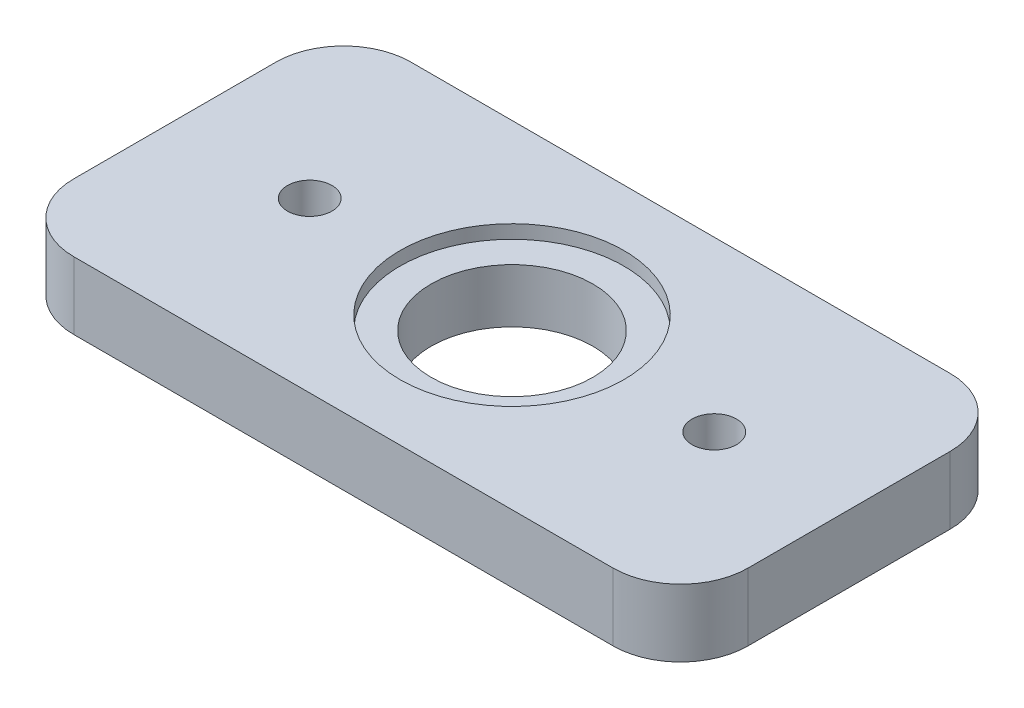
ISO-10303-21;
HEADER;
FILE_DESCRIPTION(('STEP AP214'),'2;1');
FILE_NAME('part.step','',(''),(''),'','','');
FILE_SCHEMA(('AUTOMOTIVE_DESIGN { 1 0 10303 214 1 1 1 1 }'));
ENDSEC;
DATA;
#1=APPLICATION_CONTEXT('core data for automotive mechanical design processes');
#2=APPLICATION_PROTOCOL_DEFINITION('international standard','automotive_design',2000,#1);
#3=PRODUCT_CONTEXT('',#1,'mechanical');
#4=PRODUCT('Part','Part','',(#3));
#5=PRODUCT_RELATED_PRODUCT_CATEGORY('part','',(#4));
#6=PRODUCT_DEFINITION_FORMATION('','',#4);
#7=PRODUCT_DEFINITION_CONTEXT('part definition',#1,'design');
#8=PRODUCT_DEFINITION('design','',#6,#7);
#9=PRODUCT_DEFINITION_SHAPE('','',#8);
#10=(LENGTH_UNIT() NAMED_UNIT(*) SI_UNIT(.MILLI.,.METRE.));
#11=(NAMED_UNIT(*) PLANE_ANGLE_UNIT() SI_UNIT($,.RADIAN.));
#12=(NAMED_UNIT(*) SI_UNIT($,.STERADIAN.) SOLID_ANGLE_UNIT());
#13=UNCERTAINTY_MEASURE_WITH_UNIT(LENGTH_MEASURE(1.E-05),#10,'distance_accuracy_value','');
#14=(GEOMETRIC_REPRESENTATION_CONTEXT(3) GLOBAL_UNCERTAINTY_ASSIGNED_CONTEXT((#13)) GLOBAL_UNIT_ASSIGNED_CONTEXT((#10,
#11,#12)) REPRESENTATION_CONTEXT('',''));
#15=CARTESIAN_POINT('',(0.,0.,0.));
#16=DIRECTION('',(0.,0.,1.));
#17=DIRECTION('',(1.,0.,0.));
#18=AXIS2_PLACEMENT_3D('',#15,#16,#17);
#19=CARTESIAN_POINT('',(25.,0.,-12.5));
#20=DIRECTION('',(0.,1.,0.));
#21=DIRECTION('',(0.,0.,1.));
#22=AXIS2_PLACEMENT_3D('',#19,#20,#21);
#23=CYLINDRICAL_SURFACE('',#22,6.);
#24=CARTESIAN_POINT('',(25.,0.,-12.5));
#25=DIRECTION('',(0.,1.,0.));
#26=DIRECTION('',(0.,0.,1.));
#27=AXIS2_PLACEMENT_3D('',#24,#25,#26);
#28=CIRCLE('',#27,6.);
#29=CARTESIAN_POINT('',(25.,0.,-6.5));
#30=VERTEX_POINT('',#29);
#31=EDGE_CURVE('E130',#30,#30,#28,.T.);
#32=ORIENTED_EDGE('',*,*,#31,.F.);
#33=EDGE_LOOP('',(#32));
#34=FACE_BOUND('',#33,.T.);
#35=CARTESIAN_POINT('',(25.,4.,-12.5));
#36=DIRECTION('',(0.,1.,0.));
#37=DIRECTION('',(0.,0.,1.));
#38=AXIS2_PLACEMENT_3D('',#35,#36,#37);
#39=CIRCLE('',#38,6.);
#40=CARTESIAN_POINT('',(25.,4.,-6.5));
#41=VERTEX_POINT('',#40);
#42=EDGE_CURVE('E145',#41,#41,#39,.F.);
#43=ORIENTED_EDGE('',*,*,#42,.F.);
#44=EDGE_LOOP('',(#43));
#45=FACE_BOUND('',#44,.T.);
#46=ADVANCED_FACE('F37',(#34,#45),#23,.F.);
#47=CARTESIAN_POINT('',(0.,5.,0.));
#48=DIRECTION('',(1.,0.,0.));
#49=DIRECTION('',(0.,0.,-1.));
#50=AXIS2_PLACEMENT_3D('',#47,#48,#49);
#51=PLANE('',#50);
#52=DIRECTION('',(0.,0.,1.));
#53=VECTOR('',#52,1.);
#54=CARTESIAN_POINT('',(0.,5.,0.));
#55=LINE('',#54,#53);
#56=CARTESIAN_POINT('',(0.,5.,-20.));
#57=VERTEX_POINT('',#56);
#58=CARTESIAN_POINT('',(0.,5.,-5.));
#59=VERTEX_POINT('',#58);
#60=EDGE_CURVE('E123',#57,#59,#55,.T.);
#61=ORIENTED_EDGE('',*,*,#60,.F.);
#62=DIRECTION('',(0.,-1.,0.));
#63=VECTOR('',#62,1.);
#64=CARTESIAN_POINT('',(0.,5.,-20.));
#65=LINE('',#64,#63);
#66=CARTESIAN_POINT('',(0.,0.,-20.));
#67=VERTEX_POINT('',#66);
#68=EDGE_CURVE('E107',#57,#67,#65,.T.);
#69=ORIENTED_EDGE('',*,*,#68,.T.);
#70=DIRECTION('',(0.,0.,1.));
#71=VECTOR('',#70,1.);
#72=CARTESIAN_POINT('',(0.,0.,0.));
#73=LINE('',#72,#71);
#74=CARTESIAN_POINT('',(0.,0.,-5.));
#75=VERTEX_POINT('',#74);
#76=EDGE_CURVE('E120',#67,#75,#73,.T.);
#77=ORIENTED_EDGE('',*,*,#76,.T.);
#78=DIRECTION('',(0.,-1.,0.));
#79=VECTOR('',#78,1.);
#80=CARTESIAN_POINT('',(0.,5.,-5.));
#81=LINE('',#80,#79);
#82=EDGE_CURVE('E125',#75,#59,#81,.F.);
#83=ORIENTED_EDGE('',*,*,#82,.T.);
#84=EDGE_LOOP('',(#61,#69,#77,#83));
#85=FACE_BOUND('',#84,.T.);
#86=ADVANCED_FACE('F119',(#85),#51,.F.);
#87=CARTESIAN_POINT('',(0.,5.,0.));
#88=DIRECTION('',(0.,0.,-1.));
#89=DIRECTION('',(-1.,0.,0.));
#90=AXIS2_PLACEMENT_3D('',#87,#88,#89);
#91=PLANE('',#90);
#92=DIRECTION('',(1.,0.,0.));
#93=VECTOR('',#92,1.);
#94=CARTESIAN_POINT('',(0.,5.,0.));
#95=LINE('',#94,#93);
#96=CARTESIAN_POINT('',(5.,5.,0.));
#97=VERTEX_POINT('',#96);
#98=CARTESIAN_POINT('',(45.,5.,0.));
#99=VERTEX_POINT('',#98);
#100=EDGE_CURVE('E174',#97,#99,#95,.T.);
#101=ORIENTED_EDGE('',*,*,#100,.F.);
#102=DIRECTION('',(0.,-1.,0.));
#103=VECTOR('',#102,1.);
#104=CARTESIAN_POINT('',(5.,5.,0.));
#105=LINE('',#104,#103);
#106=CARTESIAN_POINT('',(5.,0.,0.));
#107=VERTEX_POINT('',#106);
#108=EDGE_CURVE('E167',#97,#107,#105,.T.);
#109=ORIENTED_EDGE('',*,*,#108,.T.);
#110=DIRECTION('',(1.,0.,0.));
#111=VECTOR('',#110,1.);
#112=CARTESIAN_POINT('',(0.,0.,0.));
#113=LINE('',#112,#111);
#114=CARTESIAN_POINT('',(45.,0.,0.));
#115=VERTEX_POINT('',#114);
#116=EDGE_CURVE('E129',#107,#115,#113,.T.);
#117=ORIENTED_EDGE('',*,*,#116,.T.);
#118=DIRECTION('',(0.,-1.,0.));
#119=VECTOR('',#118,1.);
#120=CARTESIAN_POINT('',(45.,5.,0.));
#121=LINE('',#120,#119);
#122=EDGE_CURVE('E165',#115,#99,#121,.F.);
#123=ORIENTED_EDGE('',*,*,#122,.T.);
#124=EDGE_LOOP('',(#101,#109,#117,#123));
#125=FACE_BOUND('',#124,.T.);
#126=ADVANCED_FACE('F172',(#125),#91,.F.);
#127=CARTESIAN_POINT('',(50.,5.,0.));
#128=DIRECTION('',(-1.,0.,0.));
#129=DIRECTION('',(0.,0.,1.));
#130=AXIS2_PLACEMENT_3D('',#127,#128,#129);
#131=PLANE('',#130);
#132=DIRECTION('',(0.,0.,-1.));
#133=VECTOR('',#132,1.);
#134=CARTESIAN_POINT('',(50.,5.,0.));
#135=LINE('',#134,#133);
#136=CARTESIAN_POINT('',(50.,5.,-5.));
#137=VERTEX_POINT('',#136);
#138=CARTESIAN_POINT('',(50.,5.,-20.));
#139=VERTEX_POINT('',#138);
#140=EDGE_CURVE('E182',#137,#139,#135,.T.);
#141=ORIENTED_EDGE('',*,*,#140,.F.);
#142=DIRECTION('',(0.,-1.,0.));
#143=VECTOR('',#142,1.);
#144=CARTESIAN_POINT('',(50.,5.,-5.));
#145=LINE('',#144,#143);
#146=CARTESIAN_POINT('',(50.,0.,-5.));
#147=VERTEX_POINT('',#146);
#148=EDGE_CURVE('E11',#137,#147,#145,.T.);
#149=ORIENTED_EDGE('',*,*,#148,.T.);
#150=DIRECTION('',(0.,0.,-1.));
#151=VECTOR('',#150,1.);
#152=CARTESIAN_POINT('',(50.,0.,0.));
#153=LINE('',#152,#151);
#154=CARTESIAN_POINT('',(50.,0.,-20.));
#155=VERTEX_POINT('',#154);
#156=EDGE_CURVE('E133',#147,#155,#153,.T.);
#157=ORIENTED_EDGE('',*,*,#156,.T.);
#158=DIRECTION('',(0.,-1.,0.));
#159=VECTOR('',#158,1.);
#160=CARTESIAN_POINT('',(50.,5.,-20.));
#161=LINE('',#160,#159);
#162=EDGE_CURVE('E45',#155,#139,#161,.F.);
#163=ORIENTED_EDGE('',*,*,#162,.T.);
#164=EDGE_LOOP('',(#141,#149,#157,#163));
#165=FACE_BOUND('',#164,.T.);
#166=ADVANCED_FACE('F181',(#165),#131,.F.);
#167=CARTESIAN_POINT('',(0.,5.,-25.));
#168=DIRECTION('',(0.,0.,1.));
#169=DIRECTION('',(1.,0.,0.));
#170=AXIS2_PLACEMENT_3D('',#167,#168,#169);
#171=PLANE('',#170);
#172=DIRECTION('',(-1.,0.,0.));
#173=VECTOR('',#172,1.);
#174=CARTESIAN_POINT('',(0.,0.,-25.));
#175=LINE('',#174,#173);
#176=CARTESIAN_POINT('',(45.,0.,-25.));
#177=VERTEX_POINT('',#176);
#178=CARTESIAN_POINT('',(5.,0.,-25.));
#179=VERTEX_POINT('',#178);
#180=EDGE_CURVE('E143',#177,#179,#175,.T.);
#181=ORIENTED_EDGE('',*,*,#180,.T.);
#182=DIRECTION('',(0.,-1.,0.));
#183=VECTOR('',#182,1.);
#184=CARTESIAN_POINT('',(5.,5.,-25.));
#185=LINE('',#184,#183);
#186=CARTESIAN_POINT('',(5.,5.,-25.));
#187=VERTEX_POINT('',#186);
#188=EDGE_CURVE('E108',#179,#187,#185,.F.);
#189=ORIENTED_EDGE('',*,*,#188,.T.);
#190=DIRECTION('',(-1.,0.,0.));
#191=VECTOR('',#190,1.);
#192=CARTESIAN_POINT('',(0.,5.,-25.));
#193=LINE('',#192,#191);
#194=CARTESIAN_POINT('',(45.,5.,-25.));
#195=VERTEX_POINT('',#194);
#196=EDGE_CURVE('E139',#195,#187,#193,.T.);
#197=ORIENTED_EDGE('',*,*,#196,.F.);
#198=DIRECTION('',(0.,-1.,0.));
#199=VECTOR('',#198,1.);
#200=CARTESIAN_POINT('',(45.,5.,-25.));
#201=LINE('',#200,#199);
#202=EDGE_CURVE('E113',#195,#177,#201,.T.);
#203=ORIENTED_EDGE('',*,*,#202,.T.);
#204=EDGE_LOOP('',(#181,#189,#197,#203));
#205=FACE_BOUND('',#204,.T.);
#206=ADVANCED_FACE('F216',(#205),#171,.F.);
#207=CARTESIAN_POINT('',(0.,5.,0.));
#208=DIRECTION('',(0.,-1.,0.));
#209=DIRECTION('',(0.,0.,-1.));
#210=AXIS2_PLACEMENT_3D('',#207,#208,#209);
#211=PLANE('',#210);
#212=CARTESIAN_POINT('',(25.,5.,-12.5));
#213=DIRECTION('',(0.,1.,0.));
#214=DIRECTION('',(0.,0.,1.));
#215=AXIS2_PLACEMENT_3D('',#212,#213,#214);
#216=CIRCLE('',#215,8.3);
#217=CARTESIAN_POINT('',(25.,5.,-4.2));
#218=VERTEX_POINT('',#217);
#219=EDGE_CURVE('E198',#218,#218,#216,.T.);
#220=ORIENTED_EDGE('',*,*,#219,.F.);
#221=EDGE_LOOP('',(#220));
#222=FACE_BOUND('',#221,.T.);
#223=CARTESIAN_POINT('',(10.,5.,-12.5));
#224=DIRECTION('',(0.,1.,0.));
#225=DIRECTION('',(0.,0.,1.));
#226=AXIS2_PLACEMENT_3D('',#223,#224,#225);
#227=CIRCLE('',#226,1.65);
#228=CARTESIAN_POINT('',(10.,5.,-10.85));
#229=VERTEX_POINT('',#228);
#230=EDGE_CURVE('E190',#229,#229,#227,.T.);
#231=ORIENTED_EDGE('',*,*,#230,.F.);
#232=EDGE_LOOP('',(#231));
#233=FACE_BOUND('',#232,.T.);
#234=CARTESIAN_POINT('',(40.,5.,-12.5));
#235=DIRECTION('',(0.,1.,0.));
#236=DIRECTION('',(0.,0.,1.));
#237=AXIS2_PLACEMENT_3D('',#234,#235,#236);
#238=CIRCLE('',#237,1.65);
#239=CARTESIAN_POINT('',(40.,5.,-10.85));
#240=VERTEX_POINT('',#239);
#241=EDGE_CURVE('E136',#240,#240,#238,.T.);
#242=ORIENTED_EDGE('',*,*,#241,.F.);
#243=EDGE_LOOP('',(#242));
#244=FACE_BOUND('',#243,.T.);
#245=ORIENTED_EDGE('',*,*,#196,.T.);
#246=CARTESIAN_POINT('',(5.,5.,-20.));
#247=DIRECTION('',(0.,-1.,0.));
#248=DIRECTION('',(0.,0.,-1.));
#249=AXIS2_PLACEMENT_3D('',#246,#247,#248);
#250=CIRCLE('',#249,5.);
#251=EDGE_CURVE('E163',#187,#57,#250,.F.);
#252=ORIENTED_EDGE('',*,*,#251,.T.);
#253=ORIENTED_EDGE('',*,*,#60,.T.);
#254=CARTESIAN_POINT('',(5.,5.,-5.));
#255=DIRECTION('',(0.,-1.,0.));
#256=DIRECTION('',(0.,0.,-1.));
#257=AXIS2_PLACEMENT_3D('',#254,#255,#256);
#258=CIRCLE('',#257,5.);
#259=EDGE_CURVE('E161',#59,#97,#258,.F.);
#260=ORIENTED_EDGE('',*,*,#259,.T.);
#261=ORIENTED_EDGE('',*,*,#100,.T.);
#262=CARTESIAN_POINT('',(45.,5.,-5.));
#263=DIRECTION('',(0.,-1.,0.));
#264=DIRECTION('',(0.,0.,-1.));
#265=AXIS2_PLACEMENT_3D('',#262,#263,#264);
#266=CIRCLE('',#265,5.);
#267=EDGE_CURVE('E58',#99,#137,#266,.F.);
#268=ORIENTED_EDGE('',*,*,#267,.T.);
#269=ORIENTED_EDGE('',*,*,#140,.T.);
#270=CARTESIAN_POINT('',(45.,5.,-20.));
#271=DIRECTION('',(0.,-1.,0.));
#272=DIRECTION('',(0.,0.,-1.));
#273=AXIS2_PLACEMENT_3D('',#270,#271,#272);
#274=CIRCLE('',#273,5.);
#275=EDGE_CURVE('E158',#139,#195,#274,.F.);
#276=ORIENTED_EDGE('',*,*,#275,.T.);
#277=EDGE_LOOP('',(#245,#252,#253,#260,#261,#268,#269,#276));
#278=FACE_BOUND('',#277,.T.);
#279=ADVANCED_FACE('F213',(#222,#233,#244,#278),#211,.F.);
#280=CARTESIAN_POINT('',(0.,0.,0.));
#281=DIRECTION('',(0.,-1.,0.));
#282=DIRECTION('',(0.,0.,-1.));
#283=AXIS2_PLACEMENT_3D('',#280,#281,#282);
#284=PLANE('',#283);
#285=CARTESIAN_POINT('',(10.,0.,-12.5));
#286=DIRECTION('',(0.,1.,0.));
#287=DIRECTION('',(0.,0.,1.));
#288=AXIS2_PLACEMENT_3D('',#285,#286,#287);
#289=CIRCLE('',#288,1.65);
#290=CARTESIAN_POINT('',(10.,0.,-10.85));
#291=VERTEX_POINT('',#290);
#292=EDGE_CURVE('E148',#291,#291,#289,.T.);
#293=ORIENTED_EDGE('',*,*,#292,.T.);
#294=EDGE_LOOP('',(#293));
#295=FACE_BOUND('',#294,.T.);
#296=CARTESIAN_POINT('',(40.,0.,-12.5));
#297=DIRECTION('',(0.,1.,0.));
#298=DIRECTION('',(0.,0.,1.));
#299=AXIS2_PLACEMENT_3D('',#296,#297,#298);
#300=CIRCLE('',#299,1.65);
#301=CARTESIAN_POINT('',(40.,0.,-10.85));
#302=VERTEX_POINT('',#301);
#303=EDGE_CURVE('E193',#302,#302,#300,.T.);
#304=ORIENTED_EDGE('',*,*,#303,.T.);
#305=EDGE_LOOP('',(#304));
#306=FACE_BOUND('',#305,.T.);
#307=ORIENTED_EDGE('',*,*,#31,.T.);
#308=EDGE_LOOP('',(#307));
#309=FACE_BOUND('',#308,.T.);
#310=ORIENTED_EDGE('',*,*,#76,.F.);
#311=CARTESIAN_POINT('',(5.,0.,-20.));
#312=DIRECTION('',(0.,-1.,0.));
#313=DIRECTION('',(0.,0.,-1.));
#314=AXIS2_PLACEMENT_3D('',#311,#312,#313);
#315=CIRCLE('',#314,5.);
#316=EDGE_CURVE('E103',#67,#179,#315,.T.);
#317=ORIENTED_EDGE('',*,*,#316,.T.);
#318=ORIENTED_EDGE('',*,*,#180,.F.);
#319=CARTESIAN_POINT('',(45.,0.,-20.));
#320=DIRECTION('',(0.,-1.,0.));
#321=DIRECTION('',(0.,0.,-1.));
#322=AXIS2_PLACEMENT_3D('',#319,#320,#321);
#323=CIRCLE('',#322,5.);
#324=EDGE_CURVE('E124',#177,#155,#323,.T.);
#325=ORIENTED_EDGE('',*,*,#324,.T.);
#326=ORIENTED_EDGE('',*,*,#156,.F.);
#327=CARTESIAN_POINT('',(45.,0.,-5.));
#328=DIRECTION('',(0.,-1.,0.));
#329=DIRECTION('',(0.,0.,-1.));
#330=AXIS2_PLACEMENT_3D('',#327,#328,#329);
#331=CIRCLE('',#330,5.);
#332=EDGE_CURVE('E152',#147,#115,#331,.T.);
#333=ORIENTED_EDGE('',*,*,#332,.T.);
#334=ORIENTED_EDGE('',*,*,#116,.F.);
#335=CARTESIAN_POINT('',(5.,0.,-5.));
#336=DIRECTION('',(0.,-1.,0.));
#337=DIRECTION('',(0.,0.,-1.));
#338=AXIS2_PLACEMENT_3D('',#335,#336,#337);
#339=CIRCLE('',#338,5.);
#340=EDGE_CURVE('E114',#107,#75,#339,.T.);
#341=ORIENTED_EDGE('',*,*,#340,.T.);
#342=EDGE_LOOP('',(#310,#317,#318,#325,#326,#333,#334,#341));
#343=FACE_BOUND('',#342,.T.);
#344=ADVANCED_FACE('F127',(#295,#306,#309,#343),#284,.T.);
#345=CARTESIAN_POINT('',(40.,0.,-12.5));
#346=DIRECTION('',(0.,1.,0.));
#347=DIRECTION('',(0.,0.,1.));
#348=AXIS2_PLACEMENT_3D('',#345,#346,#347);
#349=CYLINDRICAL_SURFACE('',#348,1.65);
#350=ORIENTED_EDGE('',*,*,#303,.F.);
#351=EDGE_LOOP('',(#350));
#352=FACE_BOUND('',#351,.T.);
#353=ORIENTED_EDGE('',*,*,#241,.T.);
#354=EDGE_LOOP('',(#353));
#355=FACE_BOUND('',#354,.T.);
#356=ADVANCED_FACE('F245',(#352,#355),#349,.F.);
#357=CARTESIAN_POINT('',(10.,0.,-12.5));
#358=DIRECTION('',(0.,1.,0.));
#359=DIRECTION('',(0.,0.,1.));
#360=AXIS2_PLACEMENT_3D('',#357,#358,#359);
#361=CYLINDRICAL_SURFACE('',#360,1.65);
#362=ORIENTED_EDGE('',*,*,#292,.F.);
#363=EDGE_LOOP('',(#362));
#364=FACE_BOUND('',#363,.T.);
#365=ORIENTED_EDGE('',*,*,#230,.T.);
#366=EDGE_LOOP('',(#365));
#367=FACE_BOUND('',#366,.T.);
#368=ADVANCED_FACE('F240',(#364,#367),#361,.F.);
#369=CARTESIAN_POINT('',(25.,4.,-12.5));
#370=DIRECTION('',(0.,1.,0.));
#371=DIRECTION('',(0.,0.,1.));
#372=AXIS2_PLACEMENT_3D('',#369,#370,#371);
#373=PLANE('',#372);
#374=CARTESIAN_POINT('',(25.,4.,-12.5));
#375=DIRECTION('',(0.,1.,0.));
#376=DIRECTION('',(0.,0.,1.));
#377=AXIS2_PLACEMENT_3D('',#374,#375,#376);
#378=CIRCLE('',#377,8.3);
#379=CARTESIAN_POINT('',(25.,4.,-4.2));
#380=VERTEX_POINT('',#379);
#381=EDGE_CURVE('E149',#380,#380,#378,.T.);
#382=ORIENTED_EDGE('',*,*,#381,.T.);
#383=EDGE_LOOP('',(#382));
#384=FACE_BOUND('',#383,.T.);
#385=ORIENTED_EDGE('',*,*,#42,.T.);
#386=EDGE_LOOP('',(#385));
#387=FACE_BOUND('',#386,.T.);
#388=ADVANCED_FACE('F204',(#384,#387),#373,.T.);
#389=CARTESIAN_POINT('',(25.,4.,-12.5));
#390=DIRECTION('',(0.,1.,0.));
#391=DIRECTION('',(0.,0.,1.));
#392=AXIS2_PLACEMENT_3D('',#389,#390,#391);
#393=CYLINDRICAL_SURFACE('',#392,8.3);
#394=ORIENTED_EDGE('',*,*,#381,.F.);
#395=EDGE_LOOP('',(#394));
#396=FACE_BOUND('',#395,.T.);
#397=ORIENTED_EDGE('',*,*,#219,.T.);
#398=EDGE_LOOP('',(#397));
#399=FACE_BOUND('',#398,.T.);
#400=ADVANCED_FACE('F207',(#396,#399),#393,.F.);
#401=CARTESIAN_POINT('',(5.,5.,-20.));
#402=DIRECTION('',(0.,-1.,0.));
#403=DIRECTION('',(0.,0.,-1.));
#404=AXIS2_PLACEMENT_3D('',#401,#402,#403);
#405=CYLINDRICAL_SURFACE('',#404,5.);
#406=ORIENTED_EDGE('',*,*,#251,.F.);
#407=ORIENTED_EDGE('',*,*,#188,.F.);
#408=ORIENTED_EDGE('',*,*,#316,.F.);
#409=ORIENTED_EDGE('',*,*,#68,.F.);
#410=EDGE_LOOP('',(#406,#407,#408,#409));
#411=FACE_BOUND('',#410,.T.);
#412=ADVANCED_FACE('F106',(#411),#405,.T.);
#413=CARTESIAN_POINT('',(5.,5.,-5.));
#414=DIRECTION('',(0.,-1.,0.));
#415=DIRECTION('',(0.,0.,-1.));
#416=AXIS2_PLACEMENT_3D('',#413,#414,#415);
#417=CYLINDRICAL_SURFACE('',#416,5.);
#418=ORIENTED_EDGE('',*,*,#259,.F.);
#419=ORIENTED_EDGE('',*,*,#82,.F.);
#420=ORIENTED_EDGE('',*,*,#340,.F.);
#421=ORIENTED_EDGE('',*,*,#108,.F.);
#422=EDGE_LOOP('',(#418,#419,#420,#421));
#423=FACE_BOUND('',#422,.T.);
#424=ADVANCED_FACE('F229',(#423),#417,.T.);
#425=CARTESIAN_POINT('',(45.,5.,-5.));
#426=DIRECTION('',(0.,-1.,0.));
#427=DIRECTION('',(0.,0.,-1.));
#428=AXIS2_PLACEMENT_3D('',#425,#426,#427);
#429=CYLINDRICAL_SURFACE('',#428,5.);
#430=ORIENTED_EDGE('',*,*,#267,.F.);
#431=ORIENTED_EDGE('',*,*,#122,.F.);
#432=ORIENTED_EDGE('',*,*,#332,.F.);
#433=ORIENTED_EDGE('',*,*,#148,.F.);
#434=EDGE_LOOP('',(#430,#431,#432,#433));
#435=FACE_BOUND('',#434,.T.);
#436=ADVANCED_FACE('F180',(#435),#429,.T.);
#437=CARTESIAN_POINT('',(45.,5.,-20.));
#438=DIRECTION('',(0.,-1.,0.));
#439=DIRECTION('',(0.,0.,-1.));
#440=AXIS2_PLACEMENT_3D('',#437,#438,#439);
#441=CYLINDRICAL_SURFACE('',#440,5.);
#442=ORIENTED_EDGE('',*,*,#275,.F.);
#443=ORIENTED_EDGE('',*,*,#162,.F.);
#444=ORIENTED_EDGE('',*,*,#324,.F.);
#445=ORIENTED_EDGE('',*,*,#202,.F.);
#446=EDGE_LOOP('',(#442,#443,#444,#445));
#447=FACE_BOUND('',#446,.T.);
#448=ADVANCED_FACE('F39',(#447),#441,.T.);
#449=CLOSED_SHELL('',(#46,#86,#126,#166,#206,#279,#344,#356,#368,#388,#400,#412,#424,#436,#448));
#450=MANIFOLD_SOLID_BREP('B2',#449);
#451=ADVANCED_BREP_SHAPE_REPRESENTATION('',(#18,#450),#14);
#452=SHAPE_DEFINITION_REPRESENTATION(#9,#451);
ENDSEC;
END-ISO-10303-21;
